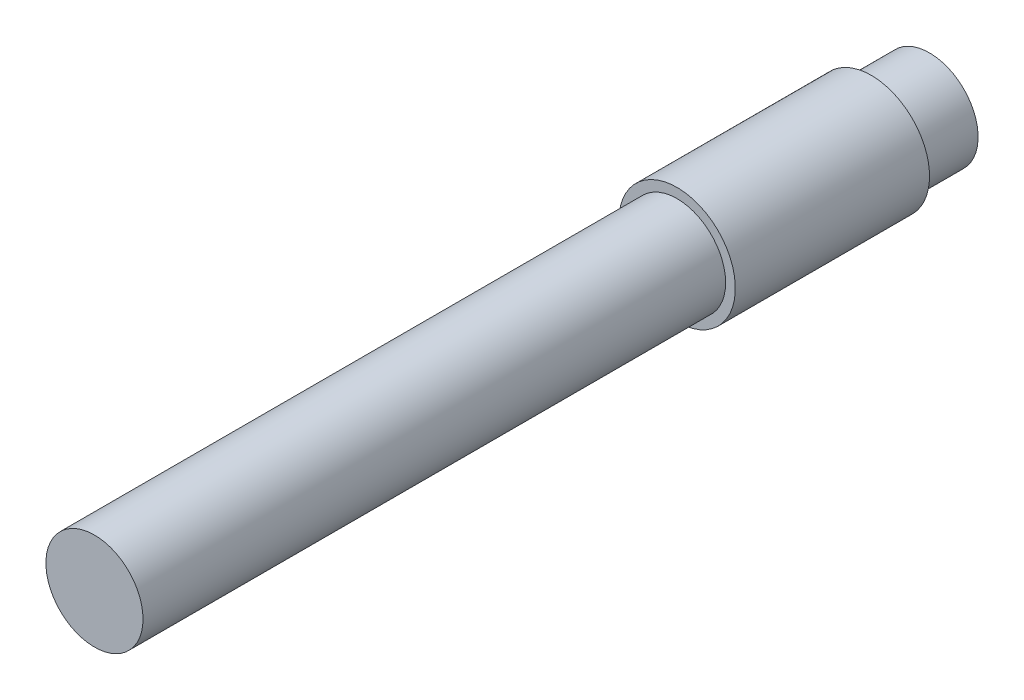
ISO-10303-21;
HEADER;
FILE_DESCRIPTION(('STEP AP214'),'2;1');
FILE_NAME('part.step','',(''),(''),'','','');
FILE_SCHEMA(('AUTOMOTIVE_DESIGN { 1 0 10303 214 1 1 1 1 }'));
ENDSEC;
DATA;
#1=APPLICATION_CONTEXT('core data for automotive mechanical design processes');
#2=APPLICATION_PROTOCOL_DEFINITION('international standard','automotive_design',2000,#1);
#3=PRODUCT_CONTEXT('',#1,'mechanical');
#4=PRODUCT('Part','Part','',(#3));
#5=PRODUCT_RELATED_PRODUCT_CATEGORY('part','',(#4));
#6=PRODUCT_DEFINITION_FORMATION('','',#4);
#7=PRODUCT_DEFINITION_CONTEXT('part definition',#1,'design');
#8=PRODUCT_DEFINITION('design','',#6,#7);
#9=PRODUCT_DEFINITION_SHAPE('','',#8);
#10=(LENGTH_UNIT() NAMED_UNIT(*) SI_UNIT(.MILLI.,.METRE.));
#11=(NAMED_UNIT(*) PLANE_ANGLE_UNIT() SI_UNIT($,.RADIAN.));
#12=(NAMED_UNIT(*) SI_UNIT($,.STERADIAN.) SOLID_ANGLE_UNIT());
#13=UNCERTAINTY_MEASURE_WITH_UNIT(LENGTH_MEASURE(1.E-05),#10,'distance_accuracy_value','');
#14=(GEOMETRIC_REPRESENTATION_CONTEXT(3) GLOBAL_UNCERTAINTY_ASSIGNED_CONTEXT((#13)) GLOBAL_UNIT_ASSIGNED_CONTEXT((#10,
#11,#12)) REPRESENTATION_CONTEXT('',''));
#15=CARTESIAN_POINT('',(0.,0.,0.));
#16=DIRECTION('',(0.,0.,1.));
#17=DIRECTION('',(1.,0.,0.));
#18=AXIS2_PLACEMENT_3D('',#15,#16,#17);
#19=CARTESIAN_POINT('',(0.,0.,47.625));
#20=DIRECTION('',(0.,0.,1.));
#21=DIRECTION('',(1.,0.,0.));
#22=AXIS2_PLACEMENT_3D('',#19,#20,#21);
#23=PLANE('',#22);
#24=CARTESIAN_POINT('',(0.,0.,47.625));
#25=DIRECTION('',(0.,0.,1.));
#26=DIRECTION('',(1.,0.,0.));
#27=AXIS2_PLACEMENT_3D('',#24,#25,#26);
#28=CIRCLE('',#27,7.9375);
#29=CARTESIAN_POINT('',(7.9375,0.,47.625));
#30=VERTEX_POINT('',#29);
#31=EDGE_CURVE('E137',#30,#30,#28,.T.);
#32=ORIENTED_EDGE('',*,*,#31,.T.);
#33=EDGE_LOOP('',(#32));
#34=FACE_BOUND('',#33,.T.);
#35=ADVANCED_FACE('F17',(#34),#23,.T.);
#36=CARTESIAN_POINT('',(0.,0.,-79.375));
#37=DIRECTION('',(0.,0.,-1.));
#38=DIRECTION('',(0.,-1.,0.));
#39=AXIS2_PLACEMENT_3D('',#36,#37,#38);
#40=PLANE('',#39);
#41=CARTESIAN_POINT('',(0.,0.,-79.375));
#42=DIRECTION('',(0.,0.,-1.));
#43=DIRECTION('',(-1.,0.,0.));
#44=AXIS2_PLACEMENT_3D('',#41,#42,#43);
#45=CIRCLE('',#44,7.9375);
#46=CARTESIAN_POINT('',(-7.9375,0.,-79.375));
#47=VERTEX_POINT('',#46);
#48=EDGE_CURVE('E123',#47,#47,#45,.T.);
#49=ORIENTED_EDGE('',*,*,#48,.F.);
#50=EDGE_LOOP('',(#49));
#51=FACE_BOUND('',#50,.T.);
#52=CARTESIAN_POINT('',(0.,0.,-79.375));
#53=DIRECTION('',(0.,0.,1.));
#54=DIRECTION('',(-1.,0.,0.));
#55=AXIS2_PLACEMENT_3D('',#52,#53,#54);
#56=CIRCLE('',#55,9.525);
#57=CARTESIAN_POINT('',(-9.525,0.,-79.375));
#58=VERTEX_POINT('',#57);
#59=EDGE_CURVE('E126',#58,#58,#56,.T.);
#60=ORIENTED_EDGE('',*,*,#59,.F.);
#61=EDGE_LOOP('',(#60));
#62=FACE_BOUND('',#61,.T.);
#63=ADVANCED_FACE('F19',(#51,#62),#40,.T.);
#64=CARTESIAN_POINT('',(0.,0.,-47.625));
#65=DIRECTION('',(0.,0.,-1.));
#66=DIRECTION('',(0.,-1.,0.));
#67=AXIS2_PLACEMENT_3D('',#64,#65,#66);
#68=PLANE('',#67);
#69=CARTESIAN_POINT('',(0.,0.,-47.625));
#70=DIRECTION('',(0.,0.,1.));
#71=DIRECTION('',(1.,0.,0.));
#72=AXIS2_PLACEMENT_3D('',#69,#70,#71);
#73=CIRCLE('',#72,7.9375);
#74=CARTESIAN_POINT('',(-7.53288806766701,-2.5019,-47.625));
#75=VERTEX_POINT('',#74);
#76=CARTESIAN_POINT('',(-7.53288806766701,2.5019,-47.625));
#77=VERTEX_POINT('',#76);
#78=EDGE_CURVE('E39',#75,#77,#73,.T.);
#79=ORIENTED_EDGE('',*,*,#78,.F.);
#80=DIRECTION('',(1.,0.,0.));
#81=VECTOR('',#80,1.);
#82=CARTESIAN_POINT('',(-9.0178553744148,-2.5019,-47.625));
#83=LINE('',#82,#81);
#84=CARTESIAN_POINT('',(-5.08,-2.5019,-47.625));
#85=VERTEX_POINT('',#84);
#86=EDGE_CURVE('E27',#75,#85,#83,.T.);
#87=ORIENTED_EDGE('',*,*,#86,.T.);
#88=DIRECTION('',(0.,1.,0.));
#89=VECTOR('',#88,1.);
#90=CARTESIAN_POINT('',(-5.08,2.5019,-47.625));
#91=LINE('',#90,#89);
#92=CARTESIAN_POINT('',(-5.08,2.5019,-47.625));
#93=VERTEX_POINT('',#92);
#94=EDGE_CURVE('E82',#85,#93,#91,.T.);
#95=ORIENTED_EDGE('',*,*,#94,.T.);
#96=DIRECTION('',(-1.,0.,0.));
#97=VECTOR('',#96,1.);
#98=CARTESIAN_POINT('',(-9.0178553744148,2.5019,-47.625));
#99=LINE('',#98,#97);
#100=EDGE_CURVE('E79',#93,#77,#99,.T.);
#101=ORIENTED_EDGE('',*,*,#100,.T.);
#102=EDGE_LOOP('',(#79,#87,#95,#101));
#103=FACE_BOUND('',#102,.T.);
#104=CARTESIAN_POINT('',(0.,0.,-47.625));
#105=DIRECTION('',(0.,0.,1.));
#106=DIRECTION('',(-1.,0.,0.));
#107=AXIS2_PLACEMENT_3D('',#104,#105,#106);
#108=CIRCLE('',#107,9.525);
#109=CARTESIAN_POINT('',(-9.525,0.,-47.625));
#110=VERTEX_POINT('',#109);
#111=EDGE_CURVE('E132',#110,#110,#108,.T.);
#112=ORIENTED_EDGE('',*,*,#111,.T.);
#113=EDGE_LOOP('',(#112));
#114=FACE_BOUND('',#113,.T.);
#115=ADVANCED_FACE('F163',(#103,#114),#68,.F.);
#116=CARTESIAN_POINT('',(0.,0.,-88.9));
#117=DIRECTION('',(0.,0.,-1.));
#118=DIRECTION('',(0.,-1.,0.));
#119=AXIS2_PLACEMENT_3D('',#116,#117,#118);
#120=PLANE('',#119);
#121=CARTESIAN_POINT('',(0.,0.,-88.9));
#122=DIRECTION('',(0.,0.,-1.));
#123=DIRECTION('',(-1.,0.,0.));
#124=AXIS2_PLACEMENT_3D('',#121,#122,#123);
#125=CIRCLE('',#124,7.9375);
#126=CARTESIAN_POINT('',(-7.9375,0.,-88.9));
#127=VERTEX_POINT('',#126);
#128=EDGE_CURVE('E125',#127,#127,#125,.T.);
#129=ORIENTED_EDGE('',*,*,#128,.T.);
#130=EDGE_LOOP('',(#129));
#131=FACE_BOUND('',#130,.T.);
#132=ADVANCED_FACE('F156',(#131),#120,.T.);
#133=CARTESIAN_POINT('',(-9.0178553744148,-2.5019,-15.875));
#134=DIRECTION('',(0.,1.,0.));
#135=DIRECTION('',(1.,0.,0.));
#136=AXIS2_PLACEMENT_3D('',#133,#134,#135);
#137=PLANE('',#136);
#138=DIRECTION('',(1.,0.,0.));
#139=VECTOR('',#138,1.);
#140=CARTESIAN_POINT('',(-9.0178553744148,-2.5019,-15.875));
#141=LINE('',#140,#139);
#142=CARTESIAN_POINT('',(-7.53288806766701,-2.5019,-15.875));
#143=VERTEX_POINT('',#142);
#144=CARTESIAN_POINT('',(-5.08,-2.5019,-15.875));
#145=VERTEX_POINT('',#144);
#146=EDGE_CURVE('E97',#143,#145,#141,.T.);
#147=ORIENTED_EDGE('',*,*,#146,.T.);
#148=DIRECTION('',(0.,0.,-1.));
#149=VECTOR('',#148,1.);
#150=CARTESIAN_POINT('',(-5.08,-2.5019,-15.875));
#151=LINE('',#150,#149);
#152=EDGE_CURVE('E90',#145,#85,#151,.T.);
#153=ORIENTED_EDGE('',*,*,#152,.T.);
#154=ORIENTED_EDGE('',*,*,#86,.F.);
#155=DIRECTION('',(0.,0.,-1.));
#156=VECTOR('',#155,1.);
#157=CARTESIAN_POINT('',(-7.53288806766701,-2.5019,-47.625));
#158=LINE('',#157,#156);
#159=EDGE_CURVE('E11',#143,#75,#158,.T.);
#160=ORIENTED_EDGE('',*,*,#159,.F.);
#161=EDGE_LOOP('',(#147,#153,#154,#160));
#162=FACE_BOUND('',#161,.T.);
#163=ADVANCED_FACE('F152',(#162),#137,.T.);
#164=CARTESIAN_POINT('',(-5.08,2.5019,-15.875));
#165=DIRECTION('',(-1.,0.,0.));
#166=DIRECTION('',(0.,1.,0.));
#167=AXIS2_PLACEMENT_3D('',#164,#165,#166);
#168=PLANE('',#167);
#169=ORIENTED_EDGE('',*,*,#94,.F.);
#170=ORIENTED_EDGE('',*,*,#152,.F.);
#171=DIRECTION('',(0.,1.,0.));
#172=VECTOR('',#171,1.);
#173=CARTESIAN_POINT('',(-5.08,2.5019,-15.875));
#174=LINE('',#173,#172);
#175=CARTESIAN_POINT('',(-5.08,2.5019,-15.875));
#176=VERTEX_POINT('',#175);
#177=EDGE_CURVE('E87',#145,#176,#174,.T.);
#178=ORIENTED_EDGE('',*,*,#177,.T.);
#179=DIRECTION('',(0.,0.,-1.));
#180=VECTOR('',#179,1.);
#181=CARTESIAN_POINT('',(-5.08,2.5019,-15.875));
#182=LINE('',#181,#180);
#183=EDGE_CURVE('E73',#176,#93,#182,.T.);
#184=ORIENTED_EDGE('',*,*,#183,.T.);
#185=EDGE_LOOP('',(#169,#170,#178,#184));
#186=FACE_BOUND('',#185,.T.);
#187=ADVANCED_FACE('F86',(#186),#168,.T.);
#188=CARTESIAN_POINT('',(-9.0178553744148,2.5019,-15.875));
#189=DIRECTION('',(0.,-1.,0.));
#190=DIRECTION('',(0.,0.,-1.));
#191=AXIS2_PLACEMENT_3D('',#188,#189,#190);
#192=PLANE('',#191);
#193=ORIENTED_EDGE('',*,*,#100,.F.);
#194=ORIENTED_EDGE('',*,*,#183,.F.);
#195=DIRECTION('',(-1.,0.,0.));
#196=VECTOR('',#195,1.);
#197=CARTESIAN_POINT('',(-9.0178553744148,2.5019,-15.875));
#198=LINE('',#197,#196);
#199=CARTESIAN_POINT('',(-7.53288806766701,2.5019,-15.875));
#200=VERTEX_POINT('',#199);
#201=EDGE_CURVE('E77',#176,#200,#198,.T.);
#202=ORIENTED_EDGE('',*,*,#201,.T.);
#203=DIRECTION('',(0.,0.,1.));
#204=VECTOR('',#203,1.);
#205=CARTESIAN_POINT('',(-7.53288806766701,2.5019,-47.625));
#206=LINE('',#205,#204);
#207=EDGE_CURVE('E104',#77,#200,#206,.T.);
#208=ORIENTED_EDGE('',*,*,#207,.F.);
#209=EDGE_LOOP('',(#193,#194,#202,#208));
#210=FACE_BOUND('',#209,.T.);
#211=ADVANCED_FACE('F74',(#210),#192,.T.);
#212=CARTESIAN_POINT('',(0.,0.,-15.875));
#213=DIRECTION('',(0.,0.,1.));
#214=DIRECTION('',(1.,0.,0.));
#215=AXIS2_PLACEMENT_3D('',#212,#213,#214);
#216=PLANE('',#215);
#217=ORIENTED_EDGE('',*,*,#146,.F.);
#218=CARTESIAN_POINT('',(0.,0.,-15.875));
#219=DIRECTION('',(0.,0.,-1.));
#220=DIRECTION('',(1.,0.,0.));
#221=AXIS2_PLACEMENT_3D('',#218,#219,#220);
#222=CIRCLE('',#221,7.9375);
#223=EDGE_CURVE('E100',#143,#200,#222,.T.);
#224=ORIENTED_EDGE('',*,*,#223,.T.);
#225=ORIENTED_EDGE('',*,*,#201,.F.);
#226=ORIENTED_EDGE('',*,*,#177,.F.);
#227=EDGE_LOOP('',(#217,#224,#225,#226));
#228=FACE_BOUND('',#227,.T.);
#229=ADVANCED_FACE('F96',(#228),#216,.F.);
#230=CARTESIAN_POINT('',(0.,0.,-47.625));
#231=DIRECTION('',(0.,0.,1.));
#232=DIRECTION('',(1.,0.,0.));
#233=AXIS2_PLACEMENT_3D('',#230,#231,#232);
#234=CYLINDRICAL_SURFACE('',#233,7.9375);
#235=ORIENTED_EDGE('',*,*,#31,.F.);
#236=EDGE_LOOP('',(#235));
#237=FACE_BOUND('',#236,.T.);
#238=ORIENTED_EDGE('',*,*,#223,.F.);
#239=ORIENTED_EDGE('',*,*,#159,.T.);
#240=ORIENTED_EDGE('',*,*,#78,.T.);
#241=ORIENTED_EDGE('',*,*,#207,.T.);
#242=EDGE_LOOP('',(#238,#239,#240,#241));
#243=FACE_BOUND('',#242,.T.);
#244=ADVANCED_FACE('F146',(#237,#243),#234,.T.);
#245=CARTESIAN_POINT('',(0.,0.,-79.375));
#246=DIRECTION('',(0.,0.,1.));
#247=DIRECTION('',(1.,0.,0.));
#248=AXIS2_PLACEMENT_3D('',#245,#246,#247);
#249=CYLINDRICAL_SURFACE('',#248,9.525);
#250=ORIENTED_EDGE('',*,*,#111,.F.);
#251=EDGE_LOOP('',(#250));
#252=FACE_BOUND('',#251,.T.);
#253=ORIENTED_EDGE('',*,*,#59,.T.);
#254=EDGE_LOOP('',(#253));
#255=FACE_BOUND('',#254,.T.);
#256=ADVANCED_FACE('F151',(#252,#255),#249,.T.);
#257=CARTESIAN_POINT('',(0.,0.,-88.9));
#258=DIRECTION('',(0.,0.,1.));
#259=DIRECTION('',(1.,0.,0.));
#260=AXIS2_PLACEMENT_3D('',#257,#258,#259);
#261=CYLINDRICAL_SURFACE('',#260,7.9375);
#262=ORIENTED_EDGE('',*,*,#48,.T.);
#263=EDGE_LOOP('',(#262));
#264=FACE_BOUND('',#263,.T.);
#265=ORIENTED_EDGE('',*,*,#128,.F.);
#266=EDGE_LOOP('',(#265));
#267=FACE_BOUND('',#266,.T.);
#268=ADVANCED_FACE('F177',(#264,#267),#261,.T.);
#269=CLOSED_SHELL('',(#35,#63,#115,#132,#163,#187,#211,#229,#244,#256,#268));
#270=MANIFOLD_SOLID_BREP('B1',#269);
#271=ADVANCED_BREP_SHAPE_REPRESENTATION('',(#18,#270),#14);
#272=SHAPE_DEFINITION_REPRESENTATION(#9,#271);
ENDSEC;
END-ISO-10303-21;
